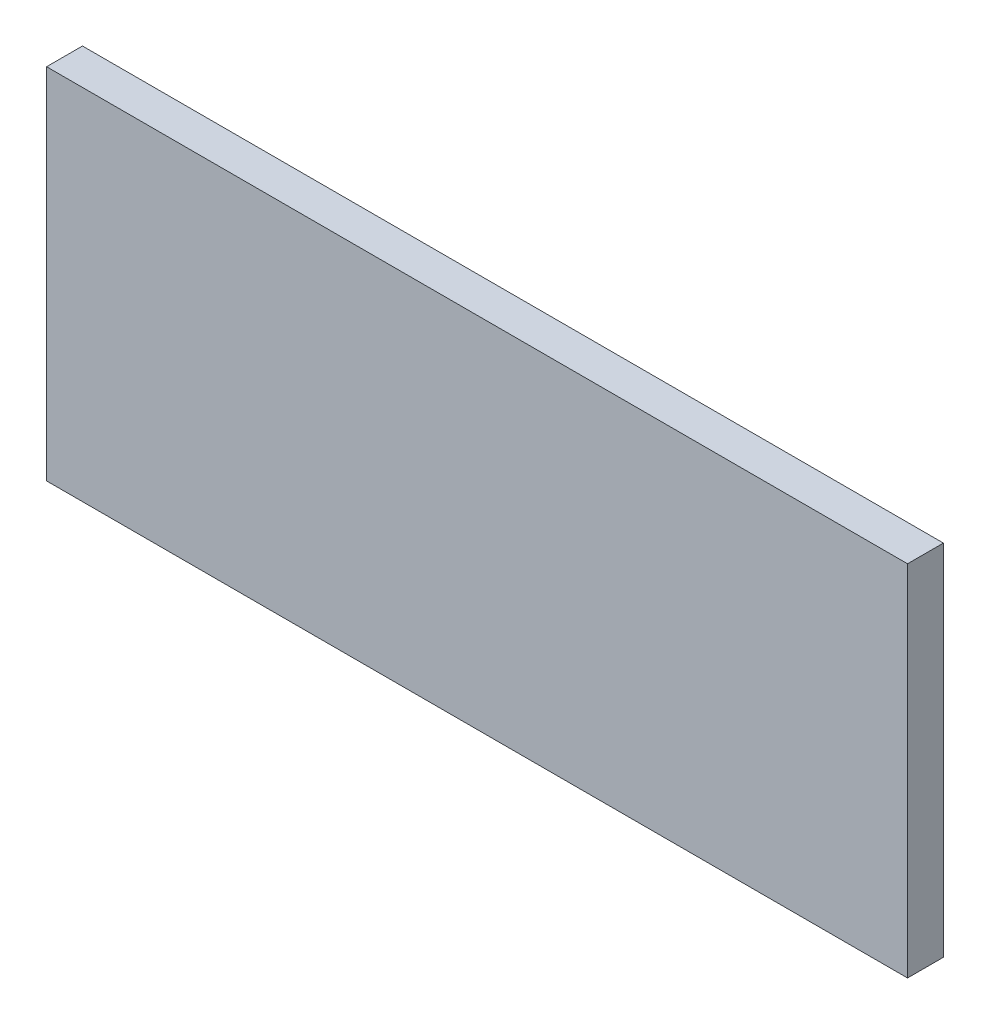
ISO-10303-21;
HEADER;
FILE_DESCRIPTION(('STEP AP214'),'2;1');
FILE_NAME('part.step','',(''),(''),'','','');
FILE_SCHEMA(('AUTOMOTIVE_DESIGN { 1 0 10303 214 1 1 1 1 }'));
ENDSEC;
DATA;
#1=APPLICATION_CONTEXT('core data for automotive mechanical design processes');
#2=APPLICATION_PROTOCOL_DEFINITION('international standard','automotive_design',2000,#1);
#3=PRODUCT_CONTEXT('',#1,'mechanical');
#4=PRODUCT('Part','Part','',(#3));
#5=PRODUCT_RELATED_PRODUCT_CATEGORY('part','',(#4));
#6=PRODUCT_DEFINITION_FORMATION('','',#4);
#7=PRODUCT_DEFINITION_CONTEXT('part definition',#1,'design');
#8=PRODUCT_DEFINITION('design','',#6,#7);
#9=PRODUCT_DEFINITION_SHAPE('','',#8);
#10=(LENGTH_UNIT() NAMED_UNIT(*) SI_UNIT(.MILLI.,.METRE.));
#11=(NAMED_UNIT(*) PLANE_ANGLE_UNIT() SI_UNIT($,.RADIAN.));
#12=(NAMED_UNIT(*) SI_UNIT($,.STERADIAN.) SOLID_ANGLE_UNIT());
#13=UNCERTAINTY_MEASURE_WITH_UNIT(LENGTH_MEASURE(1.E-05),#10,'distance_accuracy_value','');
#14=(GEOMETRIC_REPRESENTATION_CONTEXT(3) GLOBAL_UNCERTAINTY_ASSIGNED_CONTEXT((#13)) GLOBAL_UNIT_ASSIGNED_CONTEXT((#10,
#11,#12)) REPRESENTATION_CONTEXT('',''));
#15=CARTESIAN_POINT('',(0.,0.,0.));
#16=DIRECTION('',(0.,0.,1.));
#17=DIRECTION('',(1.,0.,0.));
#18=AXIS2_PLACEMENT_3D('',#15,#16,#17);
#19=CARTESIAN_POINT('',(76.2,-31.75,6.35));
#20=DIRECTION('',(-1.,0.,0.));
#21=DIRECTION('',(0.,0.,1.));
#22=AXIS2_PLACEMENT_3D('',#19,#20,#21);
#23=PLANE('',#22);
#24=DIRECTION('',(0.,1.,0.));
#25=VECTOR('',#24,1.);
#26=CARTESIAN_POINT('',(76.2,-31.75,0.));
#27=LINE('',#26,#25);
#28=CARTESIAN_POINT('',(76.2,-31.75,0.));
#29=VERTEX_POINT('',#28);
#30=CARTESIAN_POINT('',(76.2,31.75,0.));
#31=VERTEX_POINT('',#30);
#32=EDGE_CURVE('E98',#29,#31,#27,.T.);
#33=ORIENTED_EDGE('',*,*,#32,.T.);
#34=DIRECTION('',(0.,0.,-1.));
#35=VECTOR('',#34,1.);
#36=CARTESIAN_POINT('',(76.2,31.75,6.35));
#37=LINE('',#36,#35);
#38=CARTESIAN_POINT('',(76.2,31.75,6.35));
#39=VERTEX_POINT('',#38);
#40=EDGE_CURVE('E11',#39,#31,#37,.T.);
#41=ORIENTED_EDGE('',*,*,#40,.F.);
#42=DIRECTION('',(0.,1.,0.));
#43=VECTOR('',#42,1.);
#44=CARTESIAN_POINT('',(76.2,-31.75,6.35));
#45=LINE('',#44,#43);
#46=CARTESIAN_POINT('',(76.2,-31.75,6.35));
#47=VERTEX_POINT('',#46);
#48=EDGE_CURVE('E86',#47,#39,#45,.T.);
#49=ORIENTED_EDGE('',*,*,#48,.F.);
#50=DIRECTION('',(0.,0.,-1.));
#51=VECTOR('',#50,1.);
#52=CARTESIAN_POINT('',(76.2,-31.75,6.35));
#53=LINE('',#52,#51);
#54=EDGE_CURVE('E94',#47,#29,#53,.T.);
#55=ORIENTED_EDGE('',*,*,#54,.T.);
#56=EDGE_LOOP('',(#33,#41,#49,#55));
#57=FACE_BOUND('',#56,.T.);
#58=ADVANCED_FACE('F35',(#57),#23,.F.);
#59=CARTESIAN_POINT('',(-76.2,31.75,6.35));
#60=DIRECTION('',(0.,-1.,0.));
#61=DIRECTION('',(0.,0.,-1.));
#62=AXIS2_PLACEMENT_3D('',#59,#60,#61);
#63=PLANE('',#62);
#64=DIRECTION('',(-1.,0.,0.));
#65=VECTOR('',#64,1.);
#66=CARTESIAN_POINT('',(-76.2,31.75,0.));
#67=LINE('',#66,#65);
#68=CARTESIAN_POINT('',(-76.2,31.75,0.));
#69=VERTEX_POINT('',#68);
#70=EDGE_CURVE('E90',#31,#69,#67,.T.);
#71=ORIENTED_EDGE('',*,*,#70,.T.);
#72=DIRECTION('',(0.,0.,-1.));
#73=VECTOR('',#72,1.);
#74=CARTESIAN_POINT('',(-76.2,31.75,6.35));
#75=LINE('',#74,#73);
#76=CARTESIAN_POINT('',(-76.2,31.75,6.35));
#77=VERTEX_POINT('',#76);
#78=EDGE_CURVE('E43',#77,#69,#75,.T.);
#79=ORIENTED_EDGE('',*,*,#78,.F.);
#80=DIRECTION('',(-1.,0.,0.));
#81=VECTOR('',#80,1.);
#82=CARTESIAN_POINT('',(-76.2,31.75,6.35));
#83=LINE('',#82,#81);
#84=EDGE_CURVE('E81',#39,#77,#83,.T.);
#85=ORIENTED_EDGE('',*,*,#84,.F.);
#86=ORIENTED_EDGE('',*,*,#40,.T.);
#87=EDGE_LOOP('',(#71,#79,#85,#86));
#88=FACE_BOUND('',#87,.T.);
#89=ADVANCED_FACE('F89',(#88),#63,.F.);
#90=CARTESIAN_POINT('',(-76.2,-31.75,6.35));
#91=DIRECTION('',(1.,0.,0.));
#92=DIRECTION('',(0.,0.,-1.));
#93=AXIS2_PLACEMENT_3D('',#90,#91,#92);
#94=PLANE('',#93);
#95=DIRECTION('',(0.,-1.,0.));
#96=VECTOR('',#95,1.);
#97=CARTESIAN_POINT('',(-76.2,-31.75,0.));
#98=LINE('',#97,#96);
#99=CARTESIAN_POINT('',(-76.2,-31.75,0.));
#100=VERTEX_POINT('',#99);
#101=EDGE_CURVE('E68',#69,#100,#98,.T.);
#102=ORIENTED_EDGE('',*,*,#101,.T.);
#103=DIRECTION('',(0.,0.,-1.));
#104=VECTOR('',#103,1.);
#105=CARTESIAN_POINT('',(-76.2,-31.75,6.35));
#106=LINE('',#105,#104);
#107=CARTESIAN_POINT('',(-76.2,-31.75,6.35));
#108=VERTEX_POINT('',#107);
#109=EDGE_CURVE('E91',#108,#100,#106,.T.);
#110=ORIENTED_EDGE('',*,*,#109,.F.);
#111=DIRECTION('',(0.,-1.,0.));
#112=VECTOR('',#111,1.);
#113=CARTESIAN_POINT('',(-76.2,-31.75,6.35));
#114=LINE('',#113,#112);
#115=EDGE_CURVE('E84',#77,#108,#114,.T.);
#116=ORIENTED_EDGE('',*,*,#115,.F.);
#117=ORIENTED_EDGE('',*,*,#78,.T.);
#118=EDGE_LOOP('',(#102,#110,#116,#117));
#119=FACE_BOUND('',#118,.T.);
#120=ADVANCED_FACE('F92',(#119),#94,.F.);
#121=CARTESIAN_POINT('',(-76.2,-31.75,6.35));
#122=DIRECTION('',(0.,1.,0.));
#123=DIRECTION('',(0.,0.,1.));
#124=AXIS2_PLACEMENT_3D('',#121,#122,#123);
#125=PLANE('',#124);
#126=DIRECTION('',(1.,0.,0.));
#127=VECTOR('',#126,1.);
#128=CARTESIAN_POINT('',(-76.2,-31.75,0.));
#129=LINE('',#128,#127);
#130=EDGE_CURVE('E74',#100,#29,#129,.T.);
#131=ORIENTED_EDGE('',*,*,#130,.T.);
#132=ORIENTED_EDGE('',*,*,#54,.F.);
#133=DIRECTION('',(1.,0.,0.));
#134=VECTOR('',#133,1.);
#135=CARTESIAN_POINT('',(-76.2,-31.75,6.35));
#136=LINE('',#135,#134);
#137=EDGE_CURVE('E51',#108,#47,#136,.T.);
#138=ORIENTED_EDGE('',*,*,#137,.F.);
#139=ORIENTED_EDGE('',*,*,#109,.T.);
#140=EDGE_LOOP('',(#131,#132,#138,#139));
#141=FACE_BOUND('',#140,.T.);
#142=ADVANCED_FACE('F105',(#141),#125,.F.);
#143=CARTESIAN_POINT('',(0.,0.,6.35));
#144=DIRECTION('',(0.,0.,-1.));
#145=DIRECTION('',(-1.,0.,0.));
#146=AXIS2_PLACEMENT_3D('',#143,#144,#145);
#147=PLANE('',#146);
#148=ORIENTED_EDGE('',*,*,#48,.T.);
#149=ORIENTED_EDGE('',*,*,#84,.T.);
#150=ORIENTED_EDGE('',*,*,#115,.T.);
#151=ORIENTED_EDGE('',*,*,#137,.T.);
#152=EDGE_LOOP('',(#148,#149,#150,#151));
#153=FACE_BOUND('',#152,.T.);
#154=ADVANCED_FACE('F82',(#153),#147,.F.);
#155=CARTESIAN_POINT('',(0.,0.,0.));
#156=DIRECTION('',(0.,0.,-1.));
#157=DIRECTION('',(-1.,0.,0.));
#158=AXIS2_PLACEMENT_3D('',#155,#156,#157);
#159=PLANE('',#158);
#160=ORIENTED_EDGE('',*,*,#32,.F.);
#161=ORIENTED_EDGE('',*,*,#130,.F.);
#162=ORIENTED_EDGE('',*,*,#101,.F.);
#163=ORIENTED_EDGE('',*,*,#70,.F.);
#164=EDGE_LOOP('',(#160,#161,#162,#163));
#165=FACE_BOUND('',#164,.T.);
#166=ADVANCED_FACE('F108',(#165),#159,.T.);
#167=CLOSED_SHELL('',(#58,#89,#120,#142,#154,#166));
#168=MANIFOLD_SOLID_BREP('B2',#167);
#169=ADVANCED_BREP_SHAPE_REPRESENTATION('',(#18,#168),#14);
#170=SHAPE_DEFINITION_REPRESENTATION(#9,#169);
ENDSEC;
END-ISO-10303-21;
